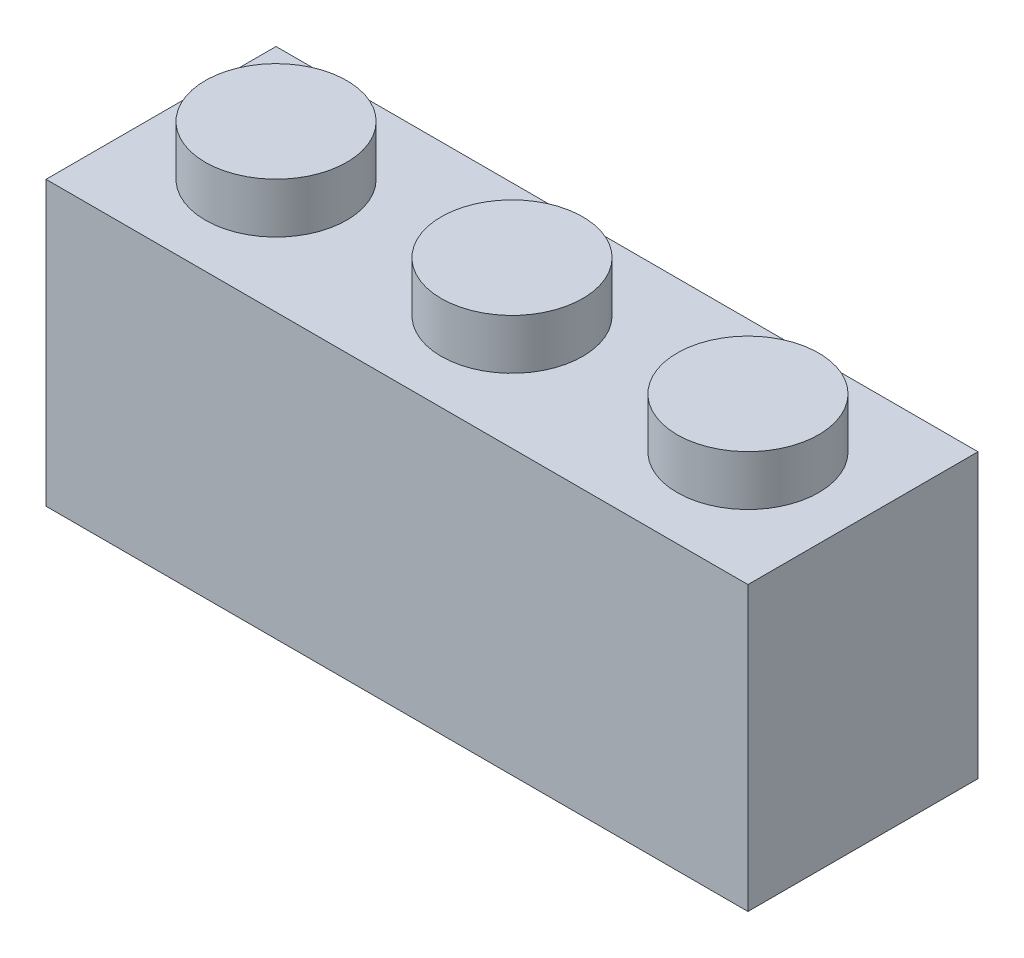
ISO-10303-21;
HEADER;
FILE_DESCRIPTION(('STEP AP214'),'2;1');
FILE_NAME('part.step','',(''),(''),'','','');
FILE_SCHEMA(('AUTOMOTIVE_DESIGN { 1 0 10303 214 1 1 1 1 }'));
ENDSEC;
DATA;
#1=APPLICATION_CONTEXT('core data for automotive mechanical design processes');
#2=APPLICATION_PROTOCOL_DEFINITION('international standard','automotive_design',2000,#1);
#3=PRODUCT_CONTEXT('',#1,'mechanical');
#4=PRODUCT('Part','Part','',(#3));
#5=PRODUCT_RELATED_PRODUCT_CATEGORY('part','',(#4));
#6=PRODUCT_DEFINITION_FORMATION('','',#4);
#7=PRODUCT_DEFINITION_CONTEXT('part definition',#1,'design');
#8=PRODUCT_DEFINITION('design','',#6,#7);
#9=PRODUCT_DEFINITION_SHAPE('','',#8);
#10=(LENGTH_UNIT() NAMED_UNIT(*) SI_UNIT(.MILLI.,.METRE.));
#11=(NAMED_UNIT(*) PLANE_ANGLE_UNIT() SI_UNIT($,.RADIAN.));
#12=(NAMED_UNIT(*) SI_UNIT($,.STERADIAN.) SOLID_ANGLE_UNIT());
#13=UNCERTAINTY_MEASURE_WITH_UNIT(LENGTH_MEASURE(1.E-05),#10,'distance_accuracy_value','');
#14=(GEOMETRIC_REPRESENTATION_CONTEXT(3) GLOBAL_UNCERTAINTY_ASSIGNED_CONTEXT((#13)) GLOBAL_UNIT_ASSIGNED_CONTEXT((#10,
#11,#12)) REPRESENTATION_CONTEXT('',''));
#15=CARTESIAN_POINT('',(0.,0.,0.));
#16=DIRECTION('',(0.,0.,1.));
#17=DIRECTION('',(1.,0.,0.));
#18=AXIS2_PLACEMENT_3D('',#15,#16,#17);
#19=CARTESIAN_POINT('',(-11.9,9.6,3.9));
#20=DIRECTION('',(1.,0.,0.));
#21=DIRECTION('',(0.,0.,-1.));
#22=AXIS2_PLACEMENT_3D('',#19,#20,#21);
#23=PLANE('',#22);
#24=DIRECTION('',(0.,0.,1.));
#25=VECTOR('',#24,1.);
#26=CARTESIAN_POINT('',(-11.9,0.,3.9));
#27=LINE('',#26,#25);
#28=CARTESIAN_POINT('',(-11.9,0.,-3.9));
#29=VERTEX_POINT('',#28);
#30=CARTESIAN_POINT('',(-11.9,0.,3.9));
#31=VERTEX_POINT('',#30);
#32=EDGE_CURVE('E96',#29,#31,#27,.T.);
#33=ORIENTED_EDGE('',*,*,#32,.T.);
#34=DIRECTION('',(0.,-1.,0.));
#35=VECTOR('',#34,1.);
#36=CARTESIAN_POINT('',(-11.9,9.6,3.9));
#37=LINE('',#36,#35);
#38=CARTESIAN_POINT('',(-11.9,9.6,3.9));
#39=VERTEX_POINT('',#38);
#40=EDGE_CURVE('E11',#39,#31,#37,.T.);
#41=ORIENTED_EDGE('',*,*,#40,.F.);
#42=DIRECTION('',(0.,0.,1.));
#43=VECTOR('',#42,1.);
#44=CARTESIAN_POINT('',(-11.9,9.6,3.9));
#45=LINE('',#44,#43);
#46=CARTESIAN_POINT('',(-11.9,9.6,-3.9));
#47=VERTEX_POINT('',#46);
#48=EDGE_CURVE('E84',#47,#39,#45,.T.);
#49=ORIENTED_EDGE('',*,*,#48,.F.);
#50=DIRECTION('',(0.,-1.,0.));
#51=VECTOR('',#50,1.);
#52=CARTESIAN_POINT('',(-11.9,9.6,-3.9));
#53=LINE('',#52,#51);
#54=EDGE_CURVE('E92',#47,#29,#53,.T.);
#55=ORIENTED_EDGE('',*,*,#54,.T.);
#56=EDGE_LOOP('',(#33,#41,#49,#55));
#57=FACE_BOUND('',#56,.T.);
#58=ADVANCED_FACE('F33',(#57),#23,.F.);
#59=CARTESIAN_POINT('',(11.9,9.6,3.9));
#60=DIRECTION('',(0.,0.,-1.));
#61=DIRECTION('',(-1.,0.,0.));
#62=AXIS2_PLACEMENT_3D('',#59,#60,#61);
#63=PLANE('',#62);
#64=DIRECTION('',(1.,0.,0.));
#65=VECTOR('',#64,1.);
#66=CARTESIAN_POINT('',(11.9,0.,3.9));
#67=LINE('',#66,#65);
#68=CARTESIAN_POINT('',(11.9,0.,3.9));
#69=VERTEX_POINT('',#68);
#70=EDGE_CURVE('E88',#31,#69,#67,.T.);
#71=ORIENTED_EDGE('',*,*,#70,.T.);
#72=DIRECTION('',(0.,-1.,0.));
#73=VECTOR('',#72,1.);
#74=CARTESIAN_POINT('',(11.9,9.6,3.9));
#75=LINE('',#74,#73);
#76=CARTESIAN_POINT('',(11.9,9.6,3.9));
#77=VERTEX_POINT('',#76);
#78=EDGE_CURVE('E41',#77,#69,#75,.T.);
#79=ORIENTED_EDGE('',*,*,#78,.F.);
#80=DIRECTION('',(1.,0.,0.));
#81=VECTOR('',#80,1.);
#82=CARTESIAN_POINT('',(11.9,9.6,3.9));
#83=LINE('',#82,#81);
#84=EDGE_CURVE('E79',#39,#77,#83,.T.);
#85=ORIENTED_EDGE('',*,*,#84,.F.);
#86=ORIENTED_EDGE('',*,*,#40,.T.);
#87=EDGE_LOOP('',(#71,#79,#85,#86));
#88=FACE_BOUND('',#87,.T.);
#89=ADVANCED_FACE('F87',(#88),#63,.F.);
#90=CARTESIAN_POINT('',(11.9,9.6,3.9));
#91=DIRECTION('',(-1.,0.,0.));
#92=DIRECTION('',(0.,0.,1.));
#93=AXIS2_PLACEMENT_3D('',#90,#91,#92);
#94=PLANE('',#93);
#95=DIRECTION('',(0.,0.,-1.));
#96=VECTOR('',#95,1.);
#97=CARTESIAN_POINT('',(11.9,0.,3.9));
#98=LINE('',#97,#96);
#99=CARTESIAN_POINT('',(11.9,0.,-3.9));
#100=VERTEX_POINT('',#99);
#101=EDGE_CURVE('E66',#69,#100,#98,.T.);
#102=ORIENTED_EDGE('',*,*,#101,.T.);
#103=DIRECTION('',(0.,-1.,0.));
#104=VECTOR('',#103,1.);
#105=CARTESIAN_POINT('',(11.9,9.6,-3.9));
#106=LINE('',#105,#104);
#107=CARTESIAN_POINT('',(11.9,9.6,-3.9));
#108=VERTEX_POINT('',#107);
#109=EDGE_CURVE('E89',#108,#100,#106,.T.);
#110=ORIENTED_EDGE('',*,*,#109,.F.);
#111=DIRECTION('',(0.,0.,-1.));
#112=VECTOR('',#111,1.);
#113=CARTESIAN_POINT('',(11.9,9.6,3.9));
#114=LINE('',#113,#112);
#115=EDGE_CURVE('E82',#77,#108,#114,.T.);
#116=ORIENTED_EDGE('',*,*,#115,.F.);
#117=ORIENTED_EDGE('',*,*,#78,.T.);
#118=EDGE_LOOP('',(#102,#110,#116,#117));
#119=FACE_BOUND('',#118,.T.);
#120=ADVANCED_FACE('F90',(#119),#94,.F.);
#121=CARTESIAN_POINT('',(11.9,9.6,-3.9));
#122=DIRECTION('',(0.,0.,1.));
#123=DIRECTION('',(1.,0.,0.));
#124=AXIS2_PLACEMENT_3D('',#121,#122,#123);
#125=PLANE('',#124);
#126=DIRECTION('',(-1.,0.,0.));
#127=VECTOR('',#126,1.);
#128=CARTESIAN_POINT('',(11.9,0.,-3.9));
#129=LINE('',#128,#127);
#130=EDGE_CURVE('E72',#100,#29,#129,.T.);
#131=ORIENTED_EDGE('',*,*,#130,.T.);
#132=ORIENTED_EDGE('',*,*,#54,.F.);
#133=DIRECTION('',(-1.,0.,0.));
#134=VECTOR('',#133,1.);
#135=CARTESIAN_POINT('',(11.9,9.6,-3.9));
#136=LINE('',#135,#134);
#137=EDGE_CURVE('E49',#108,#47,#136,.T.);
#138=ORIENTED_EDGE('',*,*,#137,.F.);
#139=ORIENTED_EDGE('',*,*,#109,.T.);
#140=EDGE_LOOP('',(#131,#132,#138,#139));
#141=FACE_BOUND('',#140,.T.);
#142=ADVANCED_FACE('F104',(#141),#125,.F.);
#143=CARTESIAN_POINT('',(0.,9.6,0.));
#144=DIRECTION('',(0.,1.,0.));
#145=DIRECTION('',(0.,0.,1.));
#146=AXIS2_PLACEMENT_3D('',#143,#144,#145);
#147=PLANE('',#146);
#148=CARTESIAN_POINT('',(8.,9.6,0.));
#149=DIRECTION('',(0.,1.,0.));
#150=DIRECTION('',(0.,0.,1.));
#151=AXIS2_PLACEMENT_3D('',#148,#149,#150);
#152=CIRCLE('',#151,2.4);
#153=CARTESIAN_POINT('',(8.,9.6,2.4));
#154=VERTEX_POINT('',#153);
#155=EDGE_CURVE('E122',#154,#154,#152,.T.);
#156=ORIENTED_EDGE('',*,*,#155,.F.);
#157=EDGE_LOOP('',(#156));
#158=FACE_BOUND('',#157,.T.);
#159=CARTESIAN_POINT('',(0.,9.6,0.));
#160=DIRECTION('',(0.,1.,0.));
#161=DIRECTION('',(0.,0.,1.));
#162=AXIS2_PLACEMENT_3D('',#159,#160,#161);
#163=CIRCLE('',#162,2.4);
#164=CARTESIAN_POINT('',(0.,9.6,2.4));
#165=VERTEX_POINT('',#164);
#166=EDGE_CURVE('E116',#165,#165,#163,.T.);
#167=ORIENTED_EDGE('',*,*,#166,.F.);
#168=EDGE_LOOP('',(#167));
#169=FACE_BOUND('',#168,.T.);
#170=CARTESIAN_POINT('',(-8.,9.6,0.));
#171=DIRECTION('',(0.,1.,0.));
#172=DIRECTION('',(0.,0.,1.));
#173=AXIS2_PLACEMENT_3D('',#170,#171,#172);
#174=CIRCLE('',#173,2.4);
#175=CARTESIAN_POINT('',(-8.,9.6,2.4));
#176=VERTEX_POINT('',#175);
#177=EDGE_CURVE('E110',#176,#176,#174,.T.);
#178=ORIENTED_EDGE('',*,*,#177,.F.);
#179=EDGE_LOOP('',(#178));
#180=FACE_BOUND('',#179,.T.);
#181=ORIENTED_EDGE('',*,*,#48,.T.);
#182=ORIENTED_EDGE('',*,*,#84,.T.);
#183=ORIENTED_EDGE('',*,*,#115,.T.);
#184=ORIENTED_EDGE('',*,*,#137,.T.);
#185=EDGE_LOOP('',(#181,#182,#183,#184));
#186=FACE_BOUND('',#185,.T.);
#187=ADVANCED_FACE('F80',(#158,#169,#180,#186),#147,.T.);
#188=CARTESIAN_POINT('',(0.,0.,0.));
#189=DIRECTION('',(0.,1.,0.));
#190=DIRECTION('',(0.,0.,1.));
#191=AXIS2_PLACEMENT_3D('',#188,#189,#190);
#192=PLANE('',#191);
#193=CARTESIAN_POINT('',(-8.,0.,0.));
#194=DIRECTION('',(0.,-1.,0.));
#195=DIRECTION('',(0.,0.,-1.));
#196=AXIS2_PLACEMENT_3D('',#193,#194,#195);
#197=CIRCLE('',#196,2.5);
#198=CARTESIAN_POINT('',(-8.,0.,-2.5));
#199=VERTEX_POINT('',#198);
#200=EDGE_CURVE('E140',#199,#199,#197,.T.);
#201=ORIENTED_EDGE('',*,*,#200,.F.);
#202=EDGE_LOOP('',(#201));
#203=FACE_BOUND('',#202,.T.);
#204=CARTESIAN_POINT('',(0.,0.,0.));
#205=DIRECTION('',(0.,-1.,0.));
#206=DIRECTION('',(0.,0.,-1.));
#207=AXIS2_PLACEMENT_3D('',#204,#205,#206);
#208=CIRCLE('',#207,2.5);
#209=CARTESIAN_POINT('',(0.,0.,-2.5));
#210=VERTEX_POINT('',#209);
#211=EDGE_CURVE('E134',#210,#210,#208,.T.);
#212=ORIENTED_EDGE('',*,*,#211,.F.);
#213=EDGE_LOOP('',(#212));
#214=FACE_BOUND('',#213,.T.);
#215=CARTESIAN_POINT('',(8.,0.,0.));
#216=DIRECTION('',(0.,-1.,0.));
#217=DIRECTION('',(0.,0.,-1.));
#218=AXIS2_PLACEMENT_3D('',#215,#216,#217);
#219=CIRCLE('',#218,2.5);
#220=CARTESIAN_POINT('',(8.,0.,-2.5));
#221=VERTEX_POINT('',#220);
#222=EDGE_CURVE('E128',#221,#221,#219,.T.);
#223=ORIENTED_EDGE('',*,*,#222,.F.);
#224=EDGE_LOOP('',(#223));
#225=FACE_BOUND('',#224,.T.);
#226=ORIENTED_EDGE('',*,*,#32,.F.);
#227=ORIENTED_EDGE('',*,*,#130,.F.);
#228=ORIENTED_EDGE('',*,*,#101,.F.);
#229=ORIENTED_EDGE('',*,*,#70,.F.);
#230=EDGE_LOOP('',(#226,#227,#228,#229));
#231=FACE_BOUND('',#230,.T.);
#232=ADVANCED_FACE('F107',(#203,#214,#225,#231),#192,.F.);
#233=CARTESIAN_POINT('',(-8.,11.3,0.));
#234=DIRECTION('',(0.,-1.,0.));
#235=DIRECTION('',(0.,0.,-1.));
#236=AXIS2_PLACEMENT_3D('',#233,#234,#235);
#237=CYLINDRICAL_SURFACE('',#236,2.4);
#238=CARTESIAN_POINT('',(-8.,11.3,0.));
#239=DIRECTION('',(0.,1.,0.));
#240=DIRECTION('',(0.,0.,1.));
#241=AXIS2_PLACEMENT_3D('',#238,#239,#240);
#242=CIRCLE('',#241,2.4);
#243=CARTESIAN_POINT('',(-8.,11.3,2.4));
#244=VERTEX_POINT('',#243);
#245=EDGE_CURVE('E99',#244,#244,#242,.T.);
#246=ORIENTED_EDGE('',*,*,#245,.F.);
#247=EDGE_LOOP('',(#246));
#248=FACE_BOUND('',#247,.T.);
#249=ORIENTED_EDGE('',*,*,#177,.T.);
#250=EDGE_LOOP('',(#249));
#251=FACE_BOUND('',#250,.T.);
#252=ADVANCED_FACE('F157',(#248,#251),#237,.T.);
#253=CARTESIAN_POINT('',(-8.,11.3,0.));
#254=DIRECTION('',(0.,1.,0.));
#255=DIRECTION('',(0.,0.,1.));
#256=AXIS2_PLACEMENT_3D('',#253,#254,#255);
#257=PLANE('',#256);
#258=ORIENTED_EDGE('',*,*,#245,.T.);
#259=EDGE_LOOP('',(#258));
#260=FACE_BOUND('',#259,.T.);
#261=ADVANCED_FACE('F196',(#260),#257,.T.);
#262=CARTESIAN_POINT('',(0.,11.3,0.));
#263=DIRECTION('',(0.,-1.,0.));
#264=DIRECTION('',(0.,0.,-1.));
#265=AXIS2_PLACEMENT_3D('',#262,#263,#264);
#266=CYLINDRICAL_SURFACE('',#265,2.4);
#267=CARTESIAN_POINT('',(0.,11.3,0.));
#268=DIRECTION('',(0.,1.,0.));
#269=DIRECTION('',(0.,0.,1.));
#270=AXIS2_PLACEMENT_3D('',#267,#268,#269);
#271=CIRCLE('',#270,2.4);
#272=CARTESIAN_POINT('',(0.,11.3,2.4));
#273=VERTEX_POINT('',#272);
#274=EDGE_CURVE('E113',#273,#273,#271,.T.);
#275=ORIENTED_EDGE('',*,*,#274,.F.);
#276=EDGE_LOOP('',(#275));
#277=FACE_BOUND('',#276,.T.);
#278=ORIENTED_EDGE('',*,*,#166,.T.);
#279=EDGE_LOOP('',(#278));
#280=FACE_BOUND('',#279,.T.);
#281=ADVANCED_FACE('F200',(#277,#280),#266,.T.);
#282=CARTESIAN_POINT('',(0.,11.3,0.));
#283=DIRECTION('',(0.,1.,0.));
#284=DIRECTION('',(0.,0.,1.));
#285=AXIS2_PLACEMENT_3D('',#282,#283,#284);
#286=PLANE('',#285);
#287=ORIENTED_EDGE('',*,*,#274,.T.);
#288=EDGE_LOOP('',(#287));
#289=FACE_BOUND('',#288,.T.);
#290=ADVANCED_FACE('F204',(#289),#286,.T.);
#291=CARTESIAN_POINT('',(8.,11.3,0.));
#292=DIRECTION('',(0.,-1.,0.));
#293=DIRECTION('',(0.,0.,-1.));
#294=AXIS2_PLACEMENT_3D('',#291,#292,#293);
#295=CYLINDRICAL_SURFACE('',#294,2.4);
#296=CARTESIAN_POINT('',(8.,11.3,0.));
#297=DIRECTION('',(0.,1.,0.));
#298=DIRECTION('',(0.,0.,1.));
#299=AXIS2_PLACEMENT_3D('',#296,#297,#298);
#300=CIRCLE('',#299,2.4);
#301=CARTESIAN_POINT('',(8.,11.3,2.4));
#302=VERTEX_POINT('',#301);
#303=EDGE_CURVE('E119',#302,#302,#300,.T.);
#304=ORIENTED_EDGE('',*,*,#303,.F.);
#305=EDGE_LOOP('',(#304));
#306=FACE_BOUND('',#305,.T.);
#307=ORIENTED_EDGE('',*,*,#155,.T.);
#308=EDGE_LOOP('',(#307));
#309=FACE_BOUND('',#308,.T.);
#310=ADVANCED_FACE('F176',(#306,#309),#295,.T.);
#311=CARTESIAN_POINT('',(8.,11.3,0.));
#312=DIRECTION('',(0.,1.,0.));
#313=DIRECTION('',(0.,0.,1.));
#314=AXIS2_PLACEMENT_3D('',#311,#312,#313);
#315=PLANE('',#314);
#316=ORIENTED_EDGE('',*,*,#303,.T.);
#317=EDGE_LOOP('',(#316));
#318=FACE_BOUND('',#317,.T.);
#319=ADVANCED_FACE('F166',(#318),#315,.T.);
#320=CARTESIAN_POINT('',(8.,1.8,0.));
#321=DIRECTION('',(0.,-1.,0.));
#322=DIRECTION('',(0.,0.,-1.));
#323=AXIS2_PLACEMENT_3D('',#320,#321,#322);
#324=CYLINDRICAL_SURFACE('',#323,2.5);
#325=CARTESIAN_POINT('',(8.,1.8,0.));
#326=DIRECTION('',(0.,-1.,0.));
#327=DIRECTION('',(0.,0.,-1.));
#328=AXIS2_PLACEMENT_3D('',#325,#326,#327);
#329=CIRCLE('',#328,2.5);
#330=CARTESIAN_POINT('',(8.,1.8,-2.5));
#331=VERTEX_POINT('',#330);
#332=EDGE_CURVE('E131',#331,#331,#329,.T.);
#333=ORIENTED_EDGE('',*,*,#332,.F.);
#334=EDGE_LOOP('',(#333));
#335=FACE_BOUND('',#334,.T.);
#336=ORIENTED_EDGE('',*,*,#222,.T.);
#337=EDGE_LOOP('',(#336));
#338=FACE_BOUND('',#337,.T.);
#339=ADVANCED_FACE('F163',(#335,#338),#324,.F.);
#340=CARTESIAN_POINT('',(8.,1.8,0.));
#341=DIRECTION('',(0.,-1.,0.));
#342=DIRECTION('',(0.,0.,-1.));
#343=AXIS2_PLACEMENT_3D('',#340,#341,#342);
#344=PLANE('',#343);
#345=ORIENTED_EDGE('',*,*,#332,.T.);
#346=EDGE_LOOP('',(#345));
#347=FACE_BOUND('',#346,.T.);
#348=ADVANCED_FACE('F165',(#347),#344,.T.);
#349=CARTESIAN_POINT('',(0.,1.8,0.));
#350=DIRECTION('',(0.,-1.,0.));
#351=DIRECTION('',(0.,0.,-1.));
#352=AXIS2_PLACEMENT_3D('',#349,#350,#351);
#353=CYLINDRICAL_SURFACE('',#352,2.5);
#354=CARTESIAN_POINT('',(0.,1.8,0.));
#355=DIRECTION('',(0.,-1.,0.));
#356=DIRECTION('',(0.,0.,-1.));
#357=AXIS2_PLACEMENT_3D('',#354,#355,#356);
#358=CIRCLE('',#357,2.5);
#359=CARTESIAN_POINT('',(0.,1.8,-2.5));
#360=VERTEX_POINT('',#359);
#361=EDGE_CURVE('E137',#360,#360,#358,.T.);
#362=ORIENTED_EDGE('',*,*,#361,.F.);
#363=EDGE_LOOP('',(#362));
#364=FACE_BOUND('',#363,.T.);
#365=ORIENTED_EDGE('',*,*,#211,.T.);
#366=EDGE_LOOP('',(#365));
#367=FACE_BOUND('',#366,.T.);
#368=ADVANCED_FACE('F173',(#364,#367),#353,.F.);
#369=CARTESIAN_POINT('',(0.,1.8,0.));
#370=DIRECTION('',(0.,-1.,0.));
#371=DIRECTION('',(0.,0.,-1.));
#372=AXIS2_PLACEMENT_3D('',#369,#370,#371);
#373=PLANE('',#372);
#374=ORIENTED_EDGE('',*,*,#361,.T.);
#375=EDGE_LOOP('',(#374));
#376=FACE_BOUND('',#375,.T.);
#377=ADVANCED_FACE('F151',(#376),#373,.T.);
#378=CARTESIAN_POINT('',(-8.,1.8,0.));
#379=DIRECTION('',(0.,-1.,0.));
#380=DIRECTION('',(0.,0.,-1.));
#381=AXIS2_PLACEMENT_3D('',#378,#379,#380);
#382=CYLINDRICAL_SURFACE('',#381,2.5);
#383=CARTESIAN_POINT('',(-8.,1.8,0.));
#384=DIRECTION('',(0.,-1.,0.));
#385=DIRECTION('',(0.,0.,-1.));
#386=AXIS2_PLACEMENT_3D('',#383,#384,#385);
#387=CIRCLE('',#386,2.5);
#388=CARTESIAN_POINT('',(-8.,1.8,-2.5));
#389=VERTEX_POINT('',#388);
#390=EDGE_CURVE('E125',#389,#389,#387,.T.);
#391=ORIENTED_EDGE('',*,*,#390,.F.);
#392=EDGE_LOOP('',(#391));
#393=FACE_BOUND('',#392,.T.);
#394=ORIENTED_EDGE('',*,*,#200,.T.);
#395=EDGE_LOOP('',(#394));
#396=FACE_BOUND('',#395,.T.);
#397=ADVANCED_FACE('F148',(#393,#396),#382,.F.);
#398=CARTESIAN_POINT('',(-8.,1.8,0.));
#399=DIRECTION('',(0.,-1.,0.));
#400=DIRECTION('',(0.,0.,-1.));
#401=AXIS2_PLACEMENT_3D('',#398,#399,#400);
#402=PLANE('',#401);
#403=ORIENTED_EDGE('',*,*,#390,.T.);
#404=EDGE_LOOP('',(#403));
#405=FACE_BOUND('',#404,.T.);
#406=ADVANCED_FACE('F146',(#405),#402,.T.);
#407=CLOSED_SHELL('',(#58,#89,#120,#142,#187,#232,#252,#261,#281,#290,#310,#319,#339,#348,#368,
#377,#397,#406));
#408=MANIFOLD_SOLID_BREP('B2',#407);
#409=ADVANCED_BREP_SHAPE_REPRESENTATION('',(#18,#408),#14);
#410=SHAPE_DEFINITION_REPRESENTATION(#9,#409);
ENDSEC;
END-ISO-10303-21;
